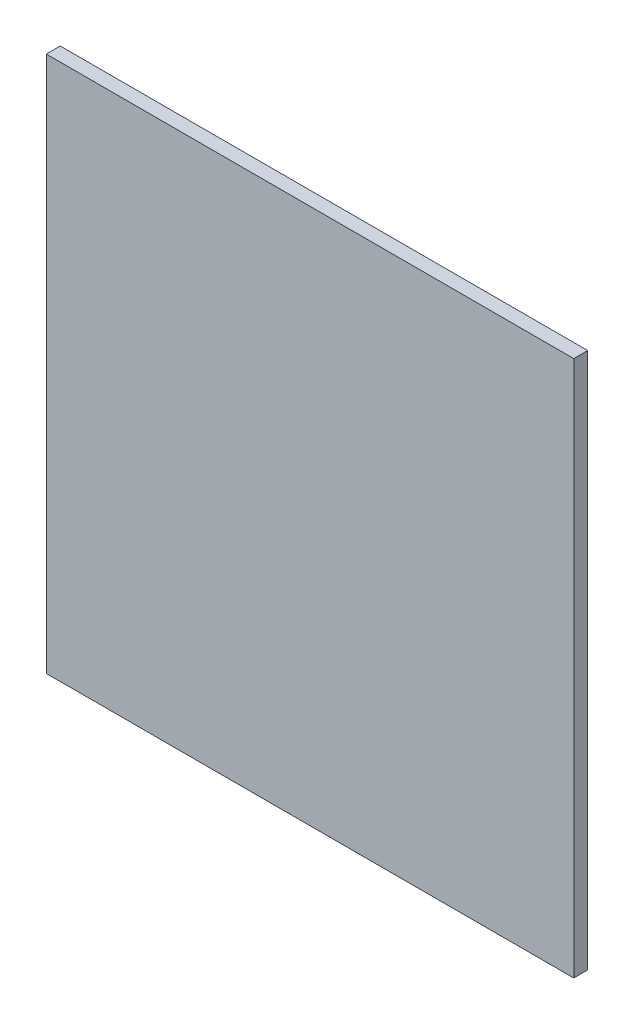
ISO-10303-21;
HEADER;
FILE_DESCRIPTION(('STEP AP214'),'2;1');
FILE_NAME('part.step','',(''),(''),'','','');
FILE_SCHEMA(('AUTOMOTIVE_DESIGN { 1 0 10303 214 1 1 1 1 }'));
ENDSEC;
DATA;
#1=APPLICATION_CONTEXT('core data for automotive mechanical design processes');
#2=APPLICATION_PROTOCOL_DEFINITION('international standard','automotive_design',2000,#1);
#3=PRODUCT_CONTEXT('',#1,'mechanical');
#4=PRODUCT('Part','Part','',(#3));
#5=PRODUCT_RELATED_PRODUCT_CATEGORY('part','',(#4));
#6=PRODUCT_DEFINITION_FORMATION('','',#4);
#7=PRODUCT_DEFINITION_CONTEXT('part definition',#1,'design');
#8=PRODUCT_DEFINITION('design','',#6,#7);
#9=PRODUCT_DEFINITION_SHAPE('','',#8);
#10=(LENGTH_UNIT() NAMED_UNIT(*) SI_UNIT(.MILLI.,.METRE.));
#11=(NAMED_UNIT(*) PLANE_ANGLE_UNIT() SI_UNIT($,.RADIAN.));
#12=(NAMED_UNIT(*) SI_UNIT($,.STERADIAN.) SOLID_ANGLE_UNIT());
#13=UNCERTAINTY_MEASURE_WITH_UNIT(LENGTH_MEASURE(1.E-05),#10,'distance_accuracy_value','');
#14=(GEOMETRIC_REPRESENTATION_CONTEXT(3) GLOBAL_UNCERTAINTY_ASSIGNED_CONTEXT((#13)) GLOBAL_UNIT_ASSIGNED_CONTEXT((#10,
#11,#12)) REPRESENTATION_CONTEXT('',''));
#15=CARTESIAN_POINT('',(0.,0.,0.));
#16=DIRECTION('',(0.,0.,1.));
#17=DIRECTION('',(1.,0.,0.));
#18=AXIS2_PLACEMENT_3D('',#15,#16,#17);
#19=CARTESIAN_POINT('',(0.,-192.215414344519,2.5));
#20=DIRECTION('',(0.,1.,0.));
#21=DIRECTION('',(0.,0.,1.));
#22=AXIS2_PLACEMENT_3D('',#19,#20,#21);
#23=PLANE('',#22);
#24=DIRECTION('',(1.,0.,0.));
#25=VECTOR('',#24,1.);
#26=CARTESIAN_POINT('',(0.,-192.215414344519,-2.5));
#27=LINE('',#26,#25);
#28=CARTESIAN_POINT('',(0.,-192.215414344519,-2.5));
#29=VERTEX_POINT('',#28);
#30=CARTESIAN_POINT('',(188.999630657016,-192.215414344519,-2.5));
#31=VERTEX_POINT('',#30);
#32=EDGE_CURVE('E110',#29,#31,#27,.T.);
#33=ORIENTED_EDGE('',*,*,#32,.T.);
#34=DIRECTION('',(0.,0.,-1.));
#35=VECTOR('',#34,1.);
#36=CARTESIAN_POINT('',(188.999630657016,-192.215414344519,2.5));
#37=LINE('',#36,#35);
#38=CARTESIAN_POINT('',(188.999630657016,-192.215414344519,2.5));
#39=VERTEX_POINT('',#38);
#40=EDGE_CURVE('E11',#39,#31,#37,.T.);
#41=ORIENTED_EDGE('',*,*,#40,.F.);
#42=DIRECTION('',(1.,0.,0.));
#43=VECTOR('',#42,1.);
#44=CARTESIAN_POINT('',(0.,-192.215414344519,2.5));
#45=LINE('',#44,#43);
#46=CARTESIAN_POINT('',(0.,-192.215414344519,2.5));
#47=VERTEX_POINT('',#46);
#48=EDGE_CURVE('E82',#47,#39,#45,.T.);
#49=ORIENTED_EDGE('',*,*,#48,.F.);
#50=DIRECTION('',(0.,0.,-1.));
#51=VECTOR('',#50,1.);
#52=CARTESIAN_POINT('',(0.,-192.215414344519,2.5));
#53=LINE('',#52,#51);
#54=EDGE_CURVE('E106',#47,#29,#53,.T.);
#55=ORIENTED_EDGE('',*,*,#54,.T.);
#56=EDGE_LOOP('',(#33,#41,#49,#55));
#57=FACE_BOUND('',#56,.T.);
#58=ADVANCED_FACE('F42',(#57),#23,.F.);
#59=CARTESIAN_POINT('',(188.999630657016,0.,2.5));
#60=DIRECTION('',(1.,0.,0.));
#61=DIRECTION('',(0.,0.,-1.));
#62=AXIS2_PLACEMENT_3D('',#59,#60,#61);
#63=PLANE('',#62);
#64=DIRECTION('',(0.,-1.,0.));
#65=VECTOR('',#64,1.);
#66=CARTESIAN_POINT('',(188.999630657016,0.,-2.5));
#67=LINE('',#66,#65);
#68=CARTESIAN_POINT('',(188.999630657016,0.,-2.5));
#69=VERTEX_POINT('',#68);
#70=EDGE_CURVE('E91',#69,#31,#67,.T.);
#71=ORIENTED_EDGE('',*,*,#70,.F.);
#72=DIRECTION('',(0.,0.,-1.));
#73=VECTOR('',#72,1.);
#74=CARTESIAN_POINT('',(188.999630657016,0.,2.5));
#75=LINE('',#74,#73);
#76=CARTESIAN_POINT('',(188.999630657016,0.,2.5));
#77=VERTEX_POINT('',#76);
#78=EDGE_CURVE('E51',#77,#69,#75,.T.);
#79=ORIENTED_EDGE('',*,*,#78,.F.);
#80=DIRECTION('',(0.,-1.,0.));
#81=VECTOR('',#80,1.);
#82=CARTESIAN_POINT('',(188.999630657016,0.,2.5));
#83=LINE('',#82,#81);
#84=EDGE_CURVE('E89',#77,#39,#83,.T.);
#85=ORIENTED_EDGE('',*,*,#84,.T.);
#86=ORIENTED_EDGE('',*,*,#40,.T.);
#87=EDGE_LOOP('',(#71,#79,#85,#86));
#88=FACE_BOUND('',#87,.T.);
#89=ADVANCED_FACE('F88',(#88),#63,.T.);
#90=CARTESIAN_POINT('',(0.,0.,2.5));
#91=DIRECTION('',(0.,1.,0.));
#92=DIRECTION('',(0.,0.,1.));
#93=AXIS2_PLACEMENT_3D('',#90,#91,#92);
#94=PLANE('',#93);
#95=DIRECTION('',(1.,0.,0.));
#96=VECTOR('',#95,1.);
#97=CARTESIAN_POINT('',(0.,0.,-2.5));
#98=LINE('',#97,#96);
#99=CARTESIAN_POINT('',(0.,0.,-2.5));
#100=VERTEX_POINT('',#99);
#101=EDGE_CURVE('E116',#100,#69,#98,.T.);
#102=ORIENTED_EDGE('',*,*,#101,.F.);
#103=DIRECTION('',(0.,0.,-1.));
#104=VECTOR('',#103,1.);
#105=CARTESIAN_POINT('',(0.,0.,2.5));
#106=LINE('',#105,#104);
#107=CARTESIAN_POINT('',(0.,0.,2.5));
#108=VERTEX_POINT('',#107);
#109=EDGE_CURVE('E74',#108,#100,#106,.T.);
#110=ORIENTED_EDGE('',*,*,#109,.F.);
#111=DIRECTION('',(1.,0.,0.));
#112=VECTOR('',#111,1.);
#113=CARTESIAN_POINT('',(0.,0.,2.5));
#114=LINE('',#113,#112);
#115=EDGE_CURVE('E98',#108,#77,#114,.T.);
#116=ORIENTED_EDGE('',*,*,#115,.T.);
#117=ORIENTED_EDGE('',*,*,#78,.T.);
#118=EDGE_LOOP('',(#102,#110,#116,#117));
#119=FACE_BOUND('',#118,.T.);
#120=ADVANCED_FACE('F101',(#119),#94,.T.);
#121=CARTESIAN_POINT('',(0.,0.,2.5));
#122=DIRECTION('',(1.,0.,0.));
#123=DIRECTION('',(0.,0.,-1.));
#124=AXIS2_PLACEMENT_3D('',#121,#122,#123);
#125=PLANE('',#124);
#126=DIRECTION('',(0.,-1.,0.));
#127=VECTOR('',#126,1.);
#128=CARTESIAN_POINT('',(0.,0.,-2.5));
#129=LINE('',#128,#127);
#130=EDGE_CURVE('E77',#100,#29,#129,.T.);
#131=ORIENTED_EDGE('',*,*,#130,.T.);
#132=ORIENTED_EDGE('',*,*,#54,.F.);
#133=DIRECTION('',(0.,-1.,0.));
#134=VECTOR('',#133,1.);
#135=CARTESIAN_POINT('',(0.,0.,2.5));
#136=LINE('',#135,#134);
#137=EDGE_CURVE('E59',#108,#47,#136,.T.);
#138=ORIENTED_EDGE('',*,*,#137,.F.);
#139=ORIENTED_EDGE('',*,*,#109,.T.);
#140=EDGE_LOOP('',(#131,#132,#138,#139));
#141=FACE_BOUND('',#140,.T.);
#142=ADVANCED_FACE('F132',(#141),#125,.F.);
#143=CARTESIAN_POINT('',(0.,0.,2.5));
#144=DIRECTION('',(0.,0.,-1.));
#145=DIRECTION('',(-1.,0.,0.));
#146=AXIS2_PLACEMENT_3D('',#143,#144,#145);
#147=PLANE('',#146);
#148=ORIENTED_EDGE('',*,*,#48,.T.);
#149=ORIENTED_EDGE('',*,*,#84,.F.);
#150=ORIENTED_EDGE('',*,*,#115,.F.);
#151=ORIENTED_EDGE('',*,*,#137,.T.);
#152=EDGE_LOOP('',(#148,#149,#150,#151));
#153=FACE_BOUND('',#152,.T.);
#154=ADVANCED_FACE('F97',(#153),#147,.F.);
#155=CARTESIAN_POINT('',(0.,0.,-2.5));
#156=DIRECTION('',(0.,0.,-1.));
#157=DIRECTION('',(-1.,0.,0.));
#158=AXIS2_PLACEMENT_3D('',#155,#156,#157);
#159=PLANE('',#158);
#160=ORIENTED_EDGE('',*,*,#32,.F.);
#161=ORIENTED_EDGE('',*,*,#130,.F.);
#162=ORIENTED_EDGE('',*,*,#101,.T.);
#163=ORIENTED_EDGE('',*,*,#70,.T.);
#164=EDGE_LOOP('',(#160,#161,#162,#163));
#165=FACE_BOUND('',#164,.T.);
#166=ADVANCED_FACE('F126',(#165),#159,.T.);
#167=CLOSED_SHELL('',(#58,#89,#120,#142,#154,#166));
#168=MANIFOLD_SOLID_BREP('B2',#167);
#169=ADVANCED_BREP_SHAPE_REPRESENTATION('',(#18,#168),#14);
#170=SHAPE_DEFINITION_REPRESENTATION(#9,#169);
ENDSEC;
END-ISO-10303-21;
